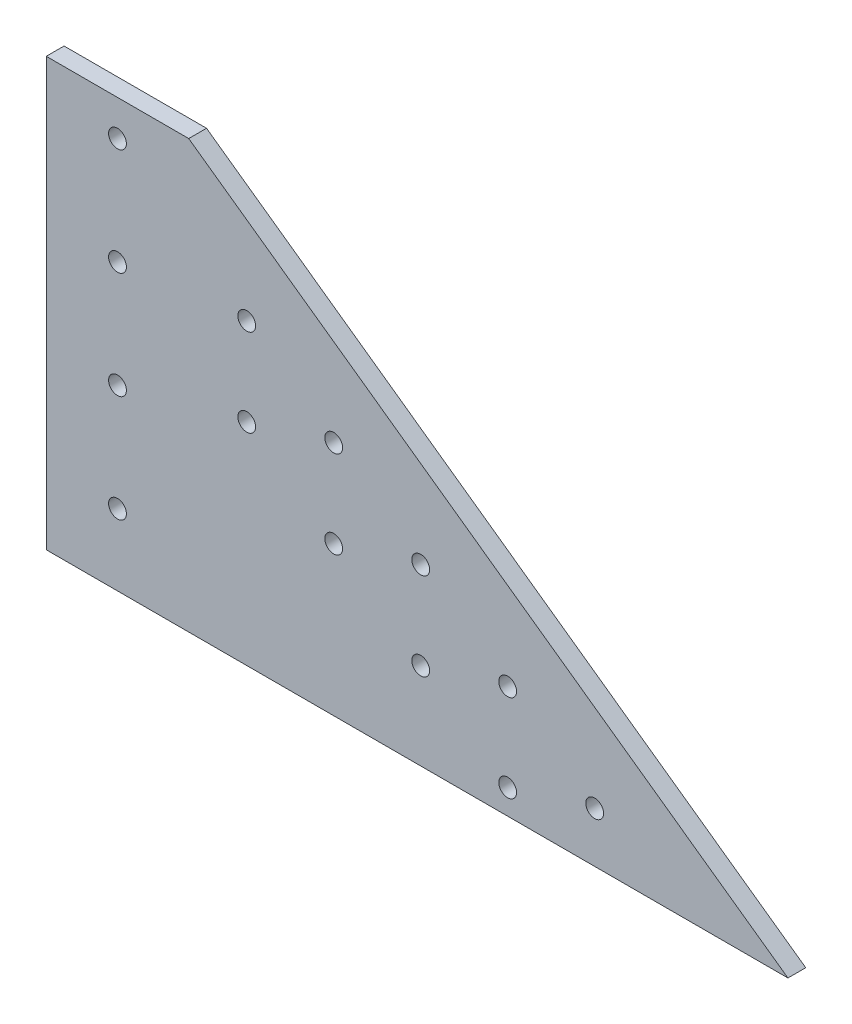
ISO-10303-21;
HEADER;
FILE_DESCRIPTION(('STEP AP214'),'2;1');
FILE_NAME('part.step','',(''),(''),'','','');
FILE_SCHEMA(('AUTOMOTIVE_DESIGN { 1 0 10303 214 1 1 1 1 }'));
ENDSEC;
DATA;
#1=APPLICATION_CONTEXT('core data for automotive mechanical design processes');
#2=APPLICATION_PROTOCOL_DEFINITION('international standard','automotive_design',2000,#1);
#3=PRODUCT_CONTEXT('',#1,'mechanical');
#4=PRODUCT('Part','Part','',(#3));
#5=PRODUCT_RELATED_PRODUCT_CATEGORY('part','',(#4));
#6=PRODUCT_DEFINITION_FORMATION('','',#4);
#7=PRODUCT_DEFINITION_CONTEXT('part definition',#1,'design');
#8=PRODUCT_DEFINITION('design','',#6,#7);
#9=PRODUCT_DEFINITION_SHAPE('','',#8);
#10=(LENGTH_UNIT() NAMED_UNIT(*) SI_UNIT(.MILLI.,.METRE.));
#11=(NAMED_UNIT(*) PLANE_ANGLE_UNIT() SI_UNIT($,.RADIAN.));
#12=(NAMED_UNIT(*) SI_UNIT($,.STERADIAN.) SOLID_ANGLE_UNIT());
#13=UNCERTAINTY_MEASURE_WITH_UNIT(LENGTH_MEASURE(1.E-05),#10,'distance_accuracy_value','');
#14=(GEOMETRIC_REPRESENTATION_CONTEXT(3) GLOBAL_UNCERTAINTY_ASSIGNED_CONTEXT((#13)) GLOBAL_UNIT_ASSIGNED_CONTEXT((#10,
#11,#12)) REPRESENTATION_CONTEXT('',''));
#15=CARTESIAN_POINT('',(0.,0.,0.));
#16=DIRECTION('',(0.,0.,1.));
#17=DIRECTION('',(1.,0.,0.));
#18=AXIS2_PLACEMENT_3D('',#15,#16,#17);
#19=CARTESIAN_POINT('',(0.,0.,3.175));
#20=DIRECTION('',(1.,0.,0.));
#21=DIRECTION('',(0.,0.,-1.));
#22=AXIS2_PLACEMENT_3D('',#19,#20,#21);
#23=PLANE('',#22);
#24=DIRECTION('',(0.,-1.,0.));
#25=VECTOR('',#24,1.);
#26=CARTESIAN_POINT('',(0.,0.,0.));
#27=LINE('',#26,#25);
#28=CARTESIAN_POINT('',(0.,0.,0.));
#29=VERTEX_POINT('',#28);
#30=CARTESIAN_POINT('',(0.,-76.2,0.));
#31=VERTEX_POINT('',#30);
#32=EDGE_CURVE('E101',#29,#31,#27,.T.);
#33=ORIENTED_EDGE('',*,*,#32,.T.);
#34=DIRECTION('',(0.,0.,-1.));
#35=VECTOR('',#34,1.);
#36=CARTESIAN_POINT('',(0.,-76.2,3.175));
#37=LINE('',#36,#35);
#38=CARTESIAN_POINT('',(0.,-76.2,3.175));
#39=VERTEX_POINT('',#38);
#40=EDGE_CURVE('E11',#39,#31,#37,.T.);
#41=ORIENTED_EDGE('',*,*,#40,.F.);
#42=DIRECTION('',(0.,-1.,0.));
#43=VECTOR('',#42,1.);
#44=CARTESIAN_POINT('',(0.,0.,3.175));
#45=LINE('',#44,#43);
#46=CARTESIAN_POINT('',(0.,0.,3.175));
#47=VERTEX_POINT('',#46);
#48=EDGE_CURVE('E89',#47,#39,#45,.T.);
#49=ORIENTED_EDGE('',*,*,#48,.F.);
#50=DIRECTION('',(0.,0.,-1.));
#51=VECTOR('',#50,1.);
#52=CARTESIAN_POINT('',(0.,0.,3.175));
#53=LINE('',#52,#51);
#54=EDGE_CURVE('E97',#47,#29,#53,.T.);
#55=ORIENTED_EDGE('',*,*,#54,.T.);
#56=EDGE_LOOP('',(#33,#41,#49,#55));
#57=FACE_BOUND('',#56,.T.);
#58=ADVANCED_FACE('F38',(#57),#23,.F.);
#59=CARTESIAN_POINT('',(132.228460039097,-76.2,3.175));
#60=DIRECTION('',(0.,1.,0.));
#61=DIRECTION('',(-1.,0.,0.));
#62=AXIS2_PLACEMENT_3D('',#59,#60,#61);
#63=PLANE('',#62);
#64=DIRECTION('',(1.,0.,0.));
#65=VECTOR('',#64,1.);
#66=CARTESIAN_POINT('',(132.228460039097,-76.2,0.));
#67=LINE('',#66,#65);
#68=CARTESIAN_POINT('',(132.228460039097,-76.2,0.));
#69=VERTEX_POINT('',#68);
#70=EDGE_CURVE('E93',#31,#69,#67,.T.);
#71=ORIENTED_EDGE('',*,*,#70,.T.);
#72=DIRECTION('',(0.,0.,-1.));
#73=VECTOR('',#72,1.);
#74=CARTESIAN_POINT('',(132.228460039097,-76.2,3.175));
#75=LINE('',#74,#73);
#76=CARTESIAN_POINT('',(132.228460039097,-76.2,3.175));
#77=VERTEX_POINT('',#76);
#78=EDGE_CURVE('E46',#77,#69,#75,.T.);
#79=ORIENTED_EDGE('',*,*,#78,.F.);
#80=DIRECTION('',(1.,0.,0.));
#81=VECTOR('',#80,1.);
#82=CARTESIAN_POINT('',(132.228460039097,-76.2,3.175));
#83=LINE('',#82,#81);
#84=EDGE_CURVE('E84',#39,#77,#83,.T.);
#85=ORIENTED_EDGE('',*,*,#84,.F.);
#86=ORIENTED_EDGE('',*,*,#40,.T.);
#87=EDGE_LOOP('',(#71,#79,#85,#86));
#88=FACE_BOUND('',#87,.T.);
#89=ADVANCED_FACE('F92',(#88),#63,.F.);
#90=CARTESIAN_POINT('',(25.4,0.,3.175));
#91=DIRECTION('',(-0.580702955710938,-0.814115518356321,0.));
#92=DIRECTION('',(0.814115518356321,-0.580702955710938,0.));
#93=AXIS2_PLACEMENT_3D('',#90,#91,#92);
#94=PLANE('',#93);
#95=DIRECTION('',(-0.814115518356321,0.580702955710938,0.));
#96=VECTOR('',#95,1.);
#97=CARTESIAN_POINT('',(25.4,0.,0.));
#98=LINE('',#97,#96);
#99=CARTESIAN_POINT('',(25.4,0.,0.));
#100=VERTEX_POINT('',#99);
#101=EDGE_CURVE('E71',#69,#100,#98,.T.);
#102=ORIENTED_EDGE('',*,*,#101,.T.);
#103=DIRECTION('',(0.,0.,-1.));
#104=VECTOR('',#103,1.);
#105=CARTESIAN_POINT('',(25.4,0.,3.175));
#106=LINE('',#105,#104);
#107=CARTESIAN_POINT('',(25.4,0.,3.175));
#108=VERTEX_POINT('',#107);
#109=EDGE_CURVE('E94',#108,#100,#106,.T.);
#110=ORIENTED_EDGE('',*,*,#109,.F.);
#111=DIRECTION('',(-0.814115518356321,0.580702955710938,0.));
#112=VECTOR('',#111,1.);
#113=CARTESIAN_POINT('',(25.4,0.,3.175));
#114=LINE('',#113,#112);
#115=EDGE_CURVE('E87',#77,#108,#114,.T.);
#116=ORIENTED_EDGE('',*,*,#115,.F.);
#117=ORIENTED_EDGE('',*,*,#78,.T.);
#118=EDGE_LOOP('',(#102,#110,#116,#117));
#119=FACE_BOUND('',#118,.T.);
#120=ADVANCED_FACE('F95',(#119),#94,.F.);
#121=CARTESIAN_POINT('',(0.,0.,3.175));
#122=DIRECTION('',(0.,-1.,0.));
#123=DIRECTION('',(0.,0.,-1.));
#124=AXIS2_PLACEMENT_3D('',#121,#122,#123);
#125=PLANE('',#124);
#126=DIRECTION('',(-1.,0.,0.));
#127=VECTOR('',#126,1.);
#128=CARTESIAN_POINT('',(0.,0.,0.));
#129=LINE('',#128,#127);
#130=EDGE_CURVE('E77',#100,#29,#129,.T.);
#131=ORIENTED_EDGE('',*,*,#130,.T.);
#132=ORIENTED_EDGE('',*,*,#54,.F.);
#133=DIRECTION('',(-1.,0.,0.));
#134=VECTOR('',#133,1.);
#135=CARTESIAN_POINT('',(0.,0.,3.175));
#136=LINE('',#135,#134);
#137=EDGE_CURVE('E54',#108,#47,#136,.T.);
#138=ORIENTED_EDGE('',*,*,#137,.F.);
#139=ORIENTED_EDGE('',*,*,#109,.T.);
#140=EDGE_LOOP('',(#131,#132,#138,#139));
#141=FACE_BOUND('',#140,.T.);
#142=ADVANCED_FACE('F109',(#141),#125,.F.);
#143=CARTESIAN_POINT('',(0.,0.,3.175));
#144=DIRECTION('',(0.,0.,-1.));
#145=DIRECTION('',(-1.,0.,0.));
#146=AXIS2_PLACEMENT_3D('',#143,#144,#145);
#147=PLANE('',#146);
#148=CARTESIAN_POINT('',(35.7392670831253,-38.5744310813036,3.175));
#149=DIRECTION('',(0.,0.,1.));
#150=DIRECTION('',(1.,0.,0.));
#151=AXIS2_PLACEMENT_3D('',#148,#149,#150);
#152=CIRCLE('',#151,1.5875);
#153=CARTESIAN_POINT('',(37.3267670831253,-38.5744310813036,3.175));
#154=VERTEX_POINT('',#153);
#155=EDGE_CURVE('E166',#154,#154,#152,.T.);
#156=ORIENTED_EDGE('',*,*,#155,.F.);
#157=EDGE_LOOP('',(#156));
#158=FACE_BOUND('',#157,.T.);
#159=CARTESIAN_POINT('',(97.7748695818769,-67.2242445345897,3.175));
#160=DIRECTION('',(0.,0.,1.));
#161=DIRECTION('',(1.,0.,0.));
#162=AXIS2_PLACEMENT_3D('',#159,#160,#161);
#163=CIRCLE('',#162,1.58749999999999);
#164=CARTESIAN_POINT('',(99.3623695818769,-67.2242445345897,3.175));
#165=VERTEX_POINT('',#164);
#166=EDGE_CURVE('E160',#165,#165,#163,.T.);
#167=ORIENTED_EDGE('',*,*,#166,.F.);
#168=EDGE_LOOP('',(#167));
#169=FACE_BOUND('',#168,.T.);
#170=CARTESIAN_POINT('',(82.265968957189,-56.1618532282963,3.175));
#171=DIRECTION('',(0.,0.,1.));
#172=DIRECTION('',(1.,0.,0.));
#173=AXIS2_PLACEMENT_3D('',#170,#171,#172);
#174=CIRCLE('',#173,1.58750000000001);
#175=CARTESIAN_POINT('',(83.853468957189,-56.1618532282963,3.175));
#176=VERTEX_POINT('',#175);
#177=EDGE_CURVE('E133',#176,#176,#174,.T.);
#178=ORIENTED_EDGE('',*,*,#177,.F.);
#179=EDGE_LOOP('',(#178));
#180=FACE_BOUND('',#179,.T.);
#181=CARTESIAN_POINT('',(51.2481677078132,-49.636822387597,3.175));
#182=DIRECTION('',(0.,0.,1.));
#183=DIRECTION('',(1.,0.,0.));
#184=AXIS2_PLACEMENT_3D('',#181,#182,#183);
#185=CIRCLE('',#184,1.5875);
#186=CARTESIAN_POINT('',(52.8356677078132,-49.636822387597,3.175));
#187=VERTEX_POINT('',#186);
#188=EDGE_CURVE('E167',#187,#187,#185,.T.);
#189=ORIENTED_EDGE('',*,*,#188,.F.);
#190=EDGE_LOOP('',(#189));
#191=FACE_BOUND('',#190,.T.);
#192=CARTESIAN_POINT('',(66.7570683325011,-60.6992136938903,3.175));
#193=DIRECTION('',(0.,0.,1.));
#194=DIRECTION('',(1.,0.,0.));
#195=AXIS2_PLACEMENT_3D('',#192,#193,#194);
#196=CIRCLE('',#195,1.58750000000001);
#197=CARTESIAN_POINT('',(68.3445683325011,-60.6992136938903,3.175));
#198=VERTEX_POINT('',#197);
#199=EDGE_CURVE('E184',#198,#198,#196,.T.);
#200=ORIENTED_EDGE('',*,*,#199,.F.);
#201=EDGE_LOOP('',(#200));
#202=FACE_BOUND('',#201,.T.);
#203=CARTESIAN_POINT('',(82.265968957189,-71.7616050001837,3.175));
#204=DIRECTION('',(0.,0.,1.));
#205=DIRECTION('',(1.,0.,0.));
#206=AXIS2_PLACEMENT_3D('',#203,#204,#205);
#207=CIRCLE('',#206,1.5875);
#208=CARTESIAN_POINT('',(83.853468957189,-71.7616050001837,3.175));
#209=VERTEX_POINT('',#208);
#210=EDGE_CURVE('E178',#209,#209,#207,.T.);
#211=ORIENTED_EDGE('',*,*,#210,.F.);
#212=EDGE_LOOP('',(#211));
#213=FACE_BOUND('',#212,.T.);
#214=CARTESIAN_POINT('',(51.2481677078132,-34.0370706157096,3.175));
#215=DIRECTION('',(0.,0.,1.));
#216=DIRECTION('',(1.,0.,0.));
#217=AXIS2_PLACEMENT_3D('',#214,#215,#216);
#218=CIRCLE('',#217,1.5875);
#219=CARTESIAN_POINT('',(52.8356677078132,-34.0370706157096,3.175));
#220=VERTEX_POINT('',#219);
#221=EDGE_CURVE('E124',#220,#220,#218,.T.);
#222=ORIENTED_EDGE('',*,*,#221,.F.);
#223=EDGE_LOOP('',(#222));
#224=FACE_BOUND('',#223,.T.);
#225=CARTESIAN_POINT('',(35.7392670831253,-22.9746793094163,3.175));
#226=DIRECTION('',(0.,0.,1.));
#227=DIRECTION('',(1.,0.,0.));
#228=AXIS2_PLACEMENT_3D('',#225,#226,#227);
#229=CIRCLE('',#228,1.5875);
#230=CARTESIAN_POINT('',(37.3267670831253,-22.9746793094163,3.175));
#231=VERTEX_POINT('',#230);
#232=EDGE_CURVE('E125',#231,#231,#229,.T.);
#233=ORIENTED_EDGE('',*,*,#232,.F.);
#234=EDGE_LOOP('',(#233));
#235=FACE_BOUND('',#234,.T.);
#236=CARTESIAN_POINT('',(66.7570683325011,-45.099461922003,3.175));
#237=DIRECTION('',(0.,0.,1.));
#238=DIRECTION('',(1.,0.,0.));
#239=AXIS2_PLACEMENT_3D('',#236,#237,#238);
#240=CIRCLE('',#239,1.58750000000001);
#241=CARTESIAN_POINT('',(68.3445683325011,-45.099461922003,3.175));
#242=VERTEX_POINT('',#241);
#243=EDGE_CURVE('E132',#242,#242,#240,.T.);
#244=ORIENTED_EDGE('',*,*,#243,.F.);
#245=EDGE_LOOP('',(#244));
#246=FACE_BOUND('',#245,.T.);
#247=CARTESIAN_POINT('',(12.7,-63.5,3.175));
#248=DIRECTION('',(0.,0.,1.));
#249=DIRECTION('',(1.,0.,0.));
#250=AXIS2_PLACEMENT_3D('',#247,#248,#249);
#251=CIRCLE('',#250,1.5875);
#252=CARTESIAN_POINT('',(14.2875,-63.5,3.175));
#253=VERTEX_POINT('',#252);
#254=EDGE_CURVE('E143',#253,#253,#251,.T.);
#255=ORIENTED_EDGE('',*,*,#254,.F.);
#256=EDGE_LOOP('',(#255));
#257=FACE_BOUND('',#256,.T.);
#258=CARTESIAN_POINT('',(12.7,-44.45,3.175));
#259=DIRECTION('',(0.,0.,1.));
#260=DIRECTION('',(1.,0.,0.));
#261=AXIS2_PLACEMENT_3D('',#258,#259,#260);
#262=CIRCLE('',#261,1.5875);
#263=CARTESIAN_POINT('',(14.2875,-44.45,3.175));
#264=VERTEX_POINT('',#263);
#265=EDGE_CURVE('E149',#264,#264,#262,.T.);
#266=ORIENTED_EDGE('',*,*,#265,.F.);
#267=EDGE_LOOP('',(#266));
#268=FACE_BOUND('',#267,.T.);
#269=CARTESIAN_POINT('',(12.7,-25.4,3.175));
#270=DIRECTION('',(0.,0.,1.));
#271=DIRECTION('',(1.,0.,0.));
#272=AXIS2_PLACEMENT_3D('',#269,#270,#271);
#273=CIRCLE('',#272,1.5875);
#274=CARTESIAN_POINT('',(14.2875,-25.4,3.175));
#275=VERTEX_POINT('',#274);
#276=EDGE_CURVE('E118',#275,#275,#273,.T.);
#277=ORIENTED_EDGE('',*,*,#276,.F.);
#278=EDGE_LOOP('',(#277));
#279=FACE_BOUND('',#278,.T.);
#280=CARTESIAN_POINT('',(12.7,-6.35,3.175));
#281=DIRECTION('',(0.,0.,1.));
#282=DIRECTION('',(1.,0.,0.));
#283=AXIS2_PLACEMENT_3D('',#280,#281,#282);
#284=CIRCLE('',#283,1.5875);
#285=CARTESIAN_POINT('',(14.2875,-6.35,3.175));
#286=VERTEX_POINT('',#285);
#287=EDGE_CURVE('E104',#286,#286,#284,.T.);
#288=ORIENTED_EDGE('',*,*,#287,.F.);
#289=EDGE_LOOP('',(#288));
#290=FACE_BOUND('',#289,.T.);
#291=ORIENTED_EDGE('',*,*,#48,.T.);
#292=ORIENTED_EDGE('',*,*,#84,.T.);
#293=ORIENTED_EDGE('',*,*,#115,.T.);
#294=ORIENTED_EDGE('',*,*,#137,.T.);
#295=EDGE_LOOP('',(#291,#292,#293,#294));
#296=FACE_BOUND('',#295,.T.);
#297=ADVANCED_FACE('F85',(#158,#169,#180,#191,#202,#213,#224,#235,#246,#257,#268,#279,#290,
#296),#147,.F.);
#298=CARTESIAN_POINT('',(0.,0.,0.));
#299=DIRECTION('',(0.,0.,-1.));
#300=DIRECTION('',(-1.,0.,0.));
#301=AXIS2_PLACEMENT_3D('',#298,#299,#300);
#302=PLANE('',#301);
#303=CARTESIAN_POINT('',(35.7392670831253,-38.5744310813036,0.));
#304=DIRECTION('',(0.,0.,-1.));
#305=DIRECTION('',(-1.,0.,0.));
#306=AXIS2_PLACEMENT_3D('',#303,#304,#305);
#307=CIRCLE('',#306,1.5875);
#308=CARTESIAN_POINT('',(34.1517670831253,-38.5744310813036,0.));
#309=VERTEX_POINT('',#308);
#310=EDGE_CURVE('E163',#309,#309,#307,.F.);
#311=ORIENTED_EDGE('',*,*,#310,.T.);
#312=EDGE_LOOP('',(#311));
#313=FACE_BOUND('',#312,.T.);
#314=CARTESIAN_POINT('',(97.7748695818769,-67.2242445345897,0.));
#315=DIRECTION('',(0.,0.,-1.));
#316=DIRECTION('',(-1.,0.,0.));
#317=AXIS2_PLACEMENT_3D('',#314,#315,#316);
#318=CIRCLE('',#317,1.58749999999999);
#319=CARTESIAN_POINT('',(96.1873695818769,-67.2242445345897,0.));
#320=VERTEX_POINT('',#319);
#321=EDGE_CURVE('E170',#320,#320,#318,.F.);
#322=ORIENTED_EDGE('',*,*,#321,.T.);
#323=EDGE_LOOP('',(#322));
#324=FACE_BOUND('',#323,.T.);
#325=CARTESIAN_POINT('',(82.265968957189,-56.1618532282963,0.));
#326=DIRECTION('',(0.,0.,-1.));
#327=DIRECTION('',(-1.,0.,0.));
#328=AXIS2_PLACEMENT_3D('',#325,#326,#327);
#329=CIRCLE('',#328,1.58750000000001);
#330=CARTESIAN_POINT('',(80.678468957189,-56.1618532282963,0.));
#331=VERTEX_POINT('',#330);
#332=EDGE_CURVE('E157',#331,#331,#329,.F.);
#333=ORIENTED_EDGE('',*,*,#332,.T.);
#334=EDGE_LOOP('',(#333));
#335=FACE_BOUND('',#334,.T.);
#336=CARTESIAN_POINT('',(51.2481677078132,-49.636822387597,0.));
#337=DIRECTION('',(0.,0.,-1.));
#338=DIRECTION('',(-1.,0.,0.));
#339=AXIS2_PLACEMENT_3D('',#336,#337,#338);
#340=CIRCLE('',#339,1.5875);
#341=CARTESIAN_POINT('',(49.6606677078132,-49.636822387597,0.));
#342=VERTEX_POINT('',#341);
#343=EDGE_CURVE('E187',#342,#342,#340,.F.);
#344=ORIENTED_EDGE('',*,*,#343,.T.);
#345=EDGE_LOOP('',(#344));
#346=FACE_BOUND('',#345,.T.);
#347=CARTESIAN_POINT('',(66.7570683325011,-60.6992136938903,0.));
#348=DIRECTION('',(0.,0.,-1.));
#349=DIRECTION('',(-1.,0.,0.));
#350=AXIS2_PLACEMENT_3D('',#347,#348,#349);
#351=CIRCLE('',#350,1.58750000000001);
#352=CARTESIAN_POINT('',(65.1695683325011,-60.6992136938903,0.));
#353=VERTEX_POINT('',#352);
#354=EDGE_CURVE('E181',#353,#353,#351,.F.);
#355=ORIENTED_EDGE('',*,*,#354,.T.);
#356=EDGE_LOOP('',(#355));
#357=FACE_BOUND('',#356,.T.);
#358=CARTESIAN_POINT('',(82.265968957189,-71.7616050001837,0.));
#359=DIRECTION('',(0.,0.,-1.));
#360=DIRECTION('',(-1.,0.,0.));
#361=AXIS2_PLACEMENT_3D('',#358,#359,#360);
#362=CIRCLE('',#361,1.5875);
#363=CARTESIAN_POINT('',(80.678468957189,-71.7616050001837,0.));
#364=VERTEX_POINT('',#363);
#365=EDGE_CURVE('E175',#364,#364,#362,.F.);
#366=ORIENTED_EDGE('',*,*,#365,.T.);
#367=EDGE_LOOP('',(#366));
#368=FACE_BOUND('',#367,.T.);
#369=CARTESIAN_POINT('',(51.2481677078132,-34.0370706157096,0.));
#370=DIRECTION('',(0.,0.,-1.));
#371=DIRECTION('',(-1.,0.,0.));
#372=AXIS2_PLACEMENT_3D('',#369,#370,#371);
#373=CIRCLE('',#372,1.5875);
#374=CARTESIAN_POINT('',(49.6606677078132,-34.0370706157096,0.));
#375=VERTEX_POINT('',#374);
#376=EDGE_CURVE('E121',#375,#375,#373,.F.);
#377=ORIENTED_EDGE('',*,*,#376,.T.);
#378=EDGE_LOOP('',(#377));
#379=FACE_BOUND('',#378,.T.);
#380=CARTESIAN_POINT('',(35.7392670831253,-22.9746793094163,0.));
#381=DIRECTION('',(0.,0.,-1.));
#382=DIRECTION('',(-1.,0.,0.));
#383=AXIS2_PLACEMENT_3D('',#380,#381,#382);
#384=CIRCLE('',#383,1.5875);
#385=CARTESIAN_POINT('',(34.1517670831253,-22.9746793094163,0.));
#386=VERTEX_POINT('',#385);
#387=EDGE_CURVE('E136',#386,#386,#384,.F.);
#388=ORIENTED_EDGE('',*,*,#387,.T.);
#389=EDGE_LOOP('',(#388));
#390=FACE_BOUND('',#389,.T.);
#391=CARTESIAN_POINT('',(66.7570683325011,-45.099461922003,0.));
#392=DIRECTION('',(0.,0.,-1.));
#393=DIRECTION('',(-1.,0.,0.));
#394=AXIS2_PLACEMENT_3D('',#391,#392,#393);
#395=CIRCLE('',#394,1.58750000000001);
#396=CARTESIAN_POINT('',(65.1695683325011,-45.099461922003,0.));
#397=VERTEX_POINT('',#396);
#398=EDGE_CURVE('E129',#397,#397,#395,.F.);
#399=ORIENTED_EDGE('',*,*,#398,.T.);
#400=EDGE_LOOP('',(#399));
#401=FACE_BOUND('',#400,.T.);
#402=CARTESIAN_POINT('',(12.7,-63.5,0.));
#403=DIRECTION('',(0.,0.,-1.));
#404=DIRECTION('',(-1.,0.,0.));
#405=AXIS2_PLACEMENT_3D('',#402,#403,#404);
#406=CIRCLE('',#405,1.5875);
#407=CARTESIAN_POINT('',(11.1125,-63.5,0.));
#408=VERTEX_POINT('',#407);
#409=EDGE_CURVE('E128',#408,#408,#406,.F.);
#410=ORIENTED_EDGE('',*,*,#409,.T.);
#411=EDGE_LOOP('',(#410));
#412=FACE_BOUND('',#411,.T.);
#413=CARTESIAN_POINT('',(12.7,-44.45,0.));
#414=DIRECTION('',(0.,0.,-1.));
#415=DIRECTION('',(-1.,0.,0.));
#416=AXIS2_PLACEMENT_3D('',#413,#414,#415);
#417=CIRCLE('',#416,1.5875);
#418=CARTESIAN_POINT('',(11.1125,-44.45,0.));
#419=VERTEX_POINT('',#418);
#420=EDGE_CURVE('E146',#419,#419,#417,.F.);
#421=ORIENTED_EDGE('',*,*,#420,.T.);
#422=EDGE_LOOP('',(#421));
#423=FACE_BOUND('',#422,.T.);
#424=CARTESIAN_POINT('',(12.7,-25.4,0.));
#425=DIRECTION('',(0.,0.,-1.));
#426=DIRECTION('',(-1.,0.,0.));
#427=AXIS2_PLACEMENT_3D('',#424,#425,#426);
#428=CIRCLE('',#427,1.5875);
#429=CARTESIAN_POINT('',(11.1125,-25.4,0.));
#430=VERTEX_POINT('',#429);
#431=EDGE_CURVE('E152',#430,#430,#428,.F.);
#432=ORIENTED_EDGE('',*,*,#431,.T.);
#433=EDGE_LOOP('',(#432));
#434=FACE_BOUND('',#433,.T.);
#435=CARTESIAN_POINT('',(12.7,-6.35,0.));
#436=DIRECTION('',(0.,0.,-1.));
#437=DIRECTION('',(-1.,0.,0.));
#438=AXIS2_PLACEMENT_3D('',#435,#436,#437);
#439=CIRCLE('',#438,1.5875);
#440=CARTESIAN_POINT('',(11.1125,-6.35,0.));
#441=VERTEX_POINT('',#440);
#442=EDGE_CURVE('E115',#441,#441,#439,.F.);
#443=ORIENTED_EDGE('',*,*,#442,.T.);
#444=EDGE_LOOP('',(#443));
#445=FACE_BOUND('',#444,.T.);
#446=ORIENTED_EDGE('',*,*,#32,.F.);
#447=ORIENTED_EDGE('',*,*,#130,.F.);
#448=ORIENTED_EDGE('',*,*,#101,.F.);
#449=ORIENTED_EDGE('',*,*,#70,.F.);
#450=EDGE_LOOP('',(#446,#447,#448,#449));
#451=FACE_BOUND('',#450,.T.);
#452=ADVANCED_FACE('F112',(#313,#324,#335,#346,#357,#368,#379,#390,#401,#412,#423,#434,#445,
#451),#302,.T.);
#453=CARTESIAN_POINT('',(12.7,-6.35,-0.00100000000000013));
#454=DIRECTION('',(0.,0.,1.));
#455=DIRECTION('',(1.,0.,0.));
#456=AXIS2_PLACEMENT_3D('',#453,#454,#455);
#457=CYLINDRICAL_SURFACE('',#456,1.5875);
#458=ORIENTED_EDGE('',*,*,#442,.F.);
#459=EDGE_LOOP('',(#458));
#460=FACE_BOUND('',#459,.T.);
#461=ORIENTED_EDGE('',*,*,#287,.T.);
#462=EDGE_LOOP('',(#461));
#463=FACE_BOUND('',#462,.T.);
#464=ADVANCED_FACE('F217',(#460,#463),#457,.F.);
#465=CARTESIAN_POINT('',(12.7,-25.4,-0.00100000000000013));
#466=DIRECTION('',(0.,0.,1.));
#467=DIRECTION('',(1.,0.,0.));
#468=AXIS2_PLACEMENT_3D('',#465,#466,#467);
#469=CYLINDRICAL_SURFACE('',#468,1.5875);
#470=ORIENTED_EDGE('',*,*,#431,.F.);
#471=EDGE_LOOP('',(#470));
#472=FACE_BOUND('',#471,.T.);
#473=ORIENTED_EDGE('',*,*,#276,.T.);
#474=EDGE_LOOP('',(#473));
#475=FACE_BOUND('',#474,.T.);
#476=ADVANCED_FACE('F219',(#472,#475),#469,.F.);
#477=CARTESIAN_POINT('',(12.7,-44.45,-0.00100000000000013));
#478=DIRECTION('',(0.,0.,1.));
#479=DIRECTION('',(1.,0.,0.));
#480=AXIS2_PLACEMENT_3D('',#477,#478,#479);
#481=CYLINDRICAL_SURFACE('',#480,1.5875);
#482=ORIENTED_EDGE('',*,*,#420,.F.);
#483=EDGE_LOOP('',(#482));
#484=FACE_BOUND('',#483,.T.);
#485=ORIENTED_EDGE('',*,*,#265,.T.);
#486=EDGE_LOOP('',(#485));
#487=FACE_BOUND('',#486,.T.);
#488=ADVANCED_FACE('F226',(#484,#487),#481,.F.);
#489=CARTESIAN_POINT('',(12.7,-63.5,-0.00100000000000013));
#490=DIRECTION('',(0.,0.,1.));
#491=DIRECTION('',(1.,0.,0.));
#492=AXIS2_PLACEMENT_3D('',#489,#490,#491);
#493=CYLINDRICAL_SURFACE('',#492,1.5875);
#494=ORIENTED_EDGE('',*,*,#409,.F.);
#495=EDGE_LOOP('',(#494));
#496=FACE_BOUND('',#495,.T.);
#497=ORIENTED_EDGE('',*,*,#254,.T.);
#498=EDGE_LOOP('',(#497));
#499=FACE_BOUND('',#498,.T.);
#500=ADVANCED_FACE('F274',(#496,#499),#493,.F.);
#501=CARTESIAN_POINT('',(66.7570683325011,-45.099461922003,-0.00100000000000013));
#502=DIRECTION('',(0.,0.,1.));
#503=DIRECTION('',(1.,0.,0.));
#504=AXIS2_PLACEMENT_3D('',#501,#502,#503);
#505=CYLINDRICAL_SURFACE('',#504,1.58750000000001);
#506=ORIENTED_EDGE('',*,*,#398,.F.);
#507=EDGE_LOOP('',(#506));
#508=FACE_BOUND('',#507,.T.);
#509=ORIENTED_EDGE('',*,*,#243,.T.);
#510=EDGE_LOOP('',(#509));
#511=FACE_BOUND('',#510,.T.);
#512=ADVANCED_FACE('F284',(#508,#511),#505,.F.);
#513=CARTESIAN_POINT('',(35.7392670831253,-22.9746793094163,-0.00100000000000013));
#514=DIRECTION('',(0.,0.,1.));
#515=DIRECTION('',(1.,0.,0.));
#516=AXIS2_PLACEMENT_3D('',#513,#514,#515);
#517=CYLINDRICAL_SURFACE('',#516,1.5875);
#518=ORIENTED_EDGE('',*,*,#387,.F.);
#519=EDGE_LOOP('',(#518));
#520=FACE_BOUND('',#519,.T.);
#521=ORIENTED_EDGE('',*,*,#232,.T.);
#522=EDGE_LOOP('',(#521));
#523=FACE_BOUND('',#522,.T.);
#524=ADVANCED_FACE('F294',(#520,#523),#517,.F.);
#525=CARTESIAN_POINT('',(51.2481677078132,-34.0370706157096,-0.00100000000000013));
#526=DIRECTION('',(0.,0.,1.));
#527=DIRECTION('',(1.,0.,0.));
#528=AXIS2_PLACEMENT_3D('',#525,#526,#527);
#529=CYLINDRICAL_SURFACE('',#528,1.5875);
#530=ORIENTED_EDGE('',*,*,#376,.F.);
#531=EDGE_LOOP('',(#530));
#532=FACE_BOUND('',#531,.T.);
#533=ORIENTED_EDGE('',*,*,#221,.T.);
#534=EDGE_LOOP('',(#533));
#535=FACE_BOUND('',#534,.T.);
#536=ADVANCED_FACE('F304',(#532,#535),#529,.F.);
#537=CARTESIAN_POINT('',(82.265968957189,-71.7616050001837,-0.00100000000000013));
#538=DIRECTION('',(0.,0.,1.));
#539=DIRECTION('',(1.,0.,0.));
#540=AXIS2_PLACEMENT_3D('',#537,#538,#539);
#541=CYLINDRICAL_SURFACE('',#540,1.5875);
#542=ORIENTED_EDGE('',*,*,#365,.F.);
#543=EDGE_LOOP('',(#542));
#544=FACE_BOUND('',#543,.T.);
#545=ORIENTED_EDGE('',*,*,#210,.T.);
#546=EDGE_LOOP('',(#545));
#547=FACE_BOUND('',#546,.T.);
#548=ADVANCED_FACE('F314',(#544,#547),#541,.F.);
#549=CARTESIAN_POINT('',(66.7570683325011,-60.6992136938903,-0.00100000000000013));
#550=DIRECTION('',(0.,0.,1.));
#551=DIRECTION('',(1.,0.,0.));
#552=AXIS2_PLACEMENT_3D('',#549,#550,#551);
#553=CYLINDRICAL_SURFACE('',#552,1.58750000000001);
#554=ORIENTED_EDGE('',*,*,#354,.F.);
#555=EDGE_LOOP('',(#554));
#556=FACE_BOUND('',#555,.T.);
#557=ORIENTED_EDGE('',*,*,#199,.T.);
#558=EDGE_LOOP('',(#557));
#559=FACE_BOUND('',#558,.T.);
#560=ADVANCED_FACE('F323',(#556,#559),#553,.F.);
#561=CARTESIAN_POINT('',(51.2481677078132,-49.636822387597,-0.00100000000000013));
#562=DIRECTION('',(0.,0.,1.));
#563=DIRECTION('',(1.,0.,0.));
#564=AXIS2_PLACEMENT_3D('',#561,#562,#563);
#565=CYLINDRICAL_SURFACE('',#564,1.5875);
#566=ORIENTED_EDGE('',*,*,#343,.F.);
#567=EDGE_LOOP('',(#566));
#568=FACE_BOUND('',#567,.T.);
#569=ORIENTED_EDGE('',*,*,#188,.T.);
#570=EDGE_LOOP('',(#569));
#571=FACE_BOUND('',#570,.T.);
#572=ADVANCED_FACE('F193',(#568,#571),#565,.F.);
#573=CARTESIAN_POINT('',(82.265968957189,-56.1618532282963,-0.00100000000000013));
#574=DIRECTION('',(0.,0.,1.));
#575=DIRECTION('',(1.,0.,0.));
#576=AXIS2_PLACEMENT_3D('',#573,#574,#575);
#577=CYLINDRICAL_SURFACE('',#576,1.58750000000001);
#578=ORIENTED_EDGE('',*,*,#332,.F.);
#579=EDGE_LOOP('',(#578));
#580=FACE_BOUND('',#579,.T.);
#581=ORIENTED_EDGE('',*,*,#177,.T.);
#582=EDGE_LOOP('',(#581));
#583=FACE_BOUND('',#582,.T.);
#584=ADVANCED_FACE('F342',(#580,#583),#577,.F.);
#585=CARTESIAN_POINT('',(97.7748695818769,-67.2242445345897,-0.00100000000000013));
#586=DIRECTION('',(0.,0.,1.));
#587=DIRECTION('',(1.,0.,0.));
#588=AXIS2_PLACEMENT_3D('',#585,#586,#587);
#589=CYLINDRICAL_SURFACE('',#588,1.58749999999999);
#590=ORIENTED_EDGE('',*,*,#321,.F.);
#591=EDGE_LOOP('',(#590));
#592=FACE_BOUND('',#591,.T.);
#593=ORIENTED_EDGE('',*,*,#166,.T.);
#594=EDGE_LOOP('',(#593));
#595=FACE_BOUND('',#594,.T.);
#596=ADVANCED_FACE('F352',(#592,#595),#589,.F.);
#597=CARTESIAN_POINT('',(35.7392670831253,-38.5744310813036,-0.00100000000000013));
#598=DIRECTION('',(0.,0.,1.));
#599=DIRECTION('',(1.,0.,0.));
#600=AXIS2_PLACEMENT_3D('',#597,#598,#599);
#601=CYLINDRICAL_SURFACE('',#600,1.5875);
#602=ORIENTED_EDGE('',*,*,#310,.F.);
#603=EDGE_LOOP('',(#602));
#604=FACE_BOUND('',#603,.T.);
#605=ORIENTED_EDGE('',*,*,#155,.T.);
#606=EDGE_LOOP('',(#605));
#607=FACE_BOUND('',#606,.T.);
#608=ADVANCED_FACE('F362',(#604,#607),#601,.F.);
#609=CLOSED_SHELL('',(#58,#89,#120,#142,#297,#452,#464,#476,#488,#500,#512,#524,#536,#548,#560,
#572,#584,#596,#608));
#610=MANIFOLD_SOLID_BREP('B2',#609);
#611=ADVANCED_BREP_SHAPE_REPRESENTATION('',(#18,#610),#14);
#612=SHAPE_DEFINITION_REPRESENTATION(#9,#611);
ENDSEC;
END-ISO-10303-21;
